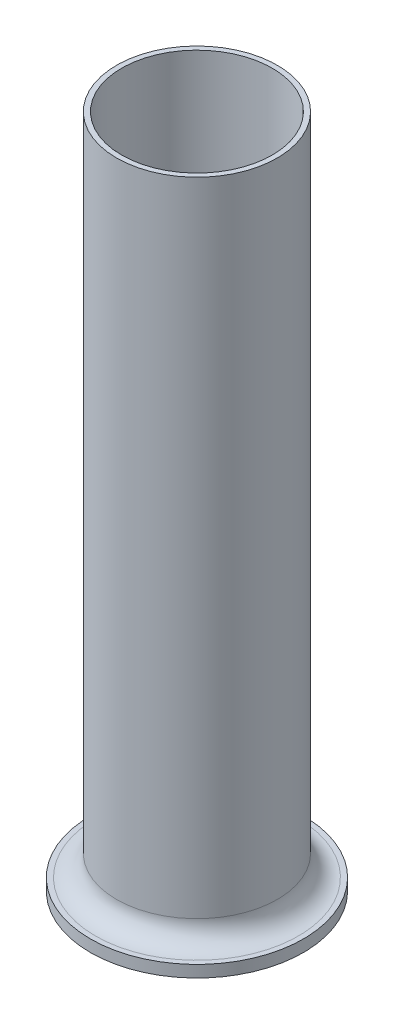
ISO-10303-21;
HEADER;
FILE_DESCRIPTION(('STEP AP214'),'2;1');
FILE_NAME('part.step','',(''),(''),'','','');
FILE_SCHEMA(('AUTOMOTIVE_DESIGN { 1 0 10303 214 1 1 1 1 }'));
ENDSEC;
DATA;
#1=APPLICATION_CONTEXT('core data for automotive mechanical design processes');
#2=APPLICATION_PROTOCOL_DEFINITION('international standard','automotive_design',2000,#1);
#3=PRODUCT_CONTEXT('',#1,'mechanical');
#4=PRODUCT('Part','Part','',(#3));
#5=PRODUCT_RELATED_PRODUCT_CATEGORY('part','',(#4));
#6=PRODUCT_DEFINITION_FORMATION('','',#4);
#7=PRODUCT_DEFINITION_CONTEXT('part definition',#1,'design');
#8=PRODUCT_DEFINITION('design','',#6,#7);
#9=PRODUCT_DEFINITION_SHAPE('','',#8);
#10=(LENGTH_UNIT() NAMED_UNIT(*) SI_UNIT(.MILLI.,.METRE.));
#11=(NAMED_UNIT(*) PLANE_ANGLE_UNIT() SI_UNIT($,.RADIAN.));
#12=(NAMED_UNIT(*) SI_UNIT($,.STERADIAN.) SOLID_ANGLE_UNIT());
#13=UNCERTAINTY_MEASURE_WITH_UNIT(LENGTH_MEASURE(1.E-05),#10,'distance_accuracy_value','');
#14=(GEOMETRIC_REPRESENTATION_CONTEXT(3) GLOBAL_UNCERTAINTY_ASSIGNED_CONTEXT((#13)) GLOBAL_UNIT_ASSIGNED_CONTEXT((#10,
#11,#12)) REPRESENTATION_CONTEXT('',''));
#15=CARTESIAN_POINT('',(0.,0.,0.));
#16=DIRECTION('',(0.,0.,1.));
#17=DIRECTION('',(1.,0.,0.));
#18=AXIS2_PLACEMENT_3D('',#15,#16,#17);
#19=CARTESIAN_POINT('',(0.,0.,0.));
#20=DIRECTION('',(0.,1.,0.));
#21=DIRECTION('',(0.,0.,1.));
#22=AXIS2_PLACEMENT_3D('',#19,#20,#21);
#23=PLANE('',#22);
#24=CARTESIAN_POINT('',(0.,0.,0.));
#25=DIRECTION('',(0.,1.,0.));
#26=DIRECTION('',(0.,0.,1.));
#27=AXIS2_PLACEMENT_3D('',#24,#25,#26);
#28=CIRCLE('',#27,25.25);
#29=CARTESIAN_POINT('',(0.,0.,25.25));
#30=VERTEX_POINT('',#29);
#31=EDGE_CURVE('E62',#30,#30,#28,.T.);
#32=ORIENTED_EDGE('',*,*,#31,.F.);
#33=EDGE_LOOP('',(#32));
#34=FACE_BOUND('',#33,.T.);
#35=CARTESIAN_POINT('',(0.,0.,0.));
#36=DIRECTION('',(0.,1.,0.));
#37=DIRECTION('',(0.,0.,1.));
#38=AXIS2_PLACEMENT_3D('',#35,#36,#37);
#39=CIRCLE('',#38,23.55);
#40=CARTESIAN_POINT('',(-23.55,0.,0.));
#41=VERTEX_POINT('',#40);
#42=EDGE_CURVE('E11',#41,#41,#39,.F.);
#43=ORIENTED_EDGE('',*,*,#42,.F.);
#44=EDGE_LOOP('',(#43));
#45=FACE_BOUND('',#44,.T.);
#46=ADVANCED_FACE('F33',(#34,#45),#23,.F.);
#47=CARTESIAN_POINT('',(0.,0.,0.));
#48=DIRECTION('',(0.,1.,0.));
#49=DIRECTION('',(0.,0.,1.));
#50=AXIS2_PLACEMENT_3D('',#47,#48,#49);
#51=CIRCLE('',#50,17.85);
#52=CARTESIAN_POINT('',(0.,0.,17.85));
#53=VERTEX_POINT('',#52);
#54=EDGE_CURVE('E54',#53,#53,#51,.T.);
#55=ORIENTED_EDGE('',*,*,#54,.T.);
#56=EDGE_LOOP('',(#55));
#57=FACE_BOUND('',#56,.T.);
#58=CARTESIAN_POINT('',(0.,0.,0.));
#59=DIRECTION('',(0.,-1.,0.));
#60=DIRECTION('',(0.,0.,-1.));
#61=AXIS2_PLACEMENT_3D('',#58,#59,#60);
#62=CIRCLE('',#61,19.95);
#63=CARTESIAN_POINT('',(-19.95,0.,0.));
#64=VERTEX_POINT('',#63);
#65=EDGE_CURVE('E41',#64,#64,#62,.F.);
#66=ORIENTED_EDGE('',*,*,#65,.F.);
#67=EDGE_LOOP('',(#66));
#68=FACE_BOUND('',#67,.T.);
#69=ADVANCED_FACE('F98',(#57,#68),#23,.F.);
#70=CARTESIAN_POINT('',(0.,2.8,0.));
#71=DIRECTION('',(0.,-1.,0.));
#72=DIRECTION('',(0.,0.,-1.));
#73=AXIS2_PLACEMENT_3D('',#70,#71,#72);
#74=CYLINDRICAL_SURFACE('',#73,25.25);
#75=CARTESIAN_POINT('',(0.,2.8,0.));
#76=DIRECTION('',(0.,1.,0.));
#77=DIRECTION('',(0.,0.,1.));
#78=AXIS2_PLACEMENT_3D('',#75,#76,#77);
#79=CIRCLE('',#78,25.25);
#80=CARTESIAN_POINT('',(0.,2.8,25.25));
#81=VERTEX_POINT('',#80);
#82=EDGE_CURVE('E63',#81,#81,#79,.T.);
#83=ORIENTED_EDGE('',*,*,#82,.F.);
#84=EDGE_LOOP('',(#83));
#85=FACE_BOUND('',#84,.T.);
#86=ORIENTED_EDGE('',*,*,#31,.T.);
#87=EDGE_LOOP('',(#86));
#88=FACE_BOUND('',#87,.T.);
#89=ADVANCED_FACE('F104',(#85,#88),#74,.T.);
#90=CARTESIAN_POINT('',(0.,2.8,0.));
#91=DIRECTION('',(0.,1.,0.));
#92=DIRECTION('',(0.,0.,1.));
#93=AXIS2_PLACEMENT_3D('',#90,#91,#92);
#94=PLANE('',#93);
#95=CARTESIAN_POINT('',(0.,2.8,0.));
#96=DIRECTION('',(0.,1.,0.));
#97=DIRECTION('',(0.,0.,1.));
#98=AXIS2_PLACEMENT_3D('',#95,#96,#97);
#99=CIRCLE('',#98,24.05);
#100=CARTESIAN_POINT('',(0.,2.8,24.05));
#101=VERTEX_POINT('',#100);
#102=EDGE_CURVE('E71',#101,#101,#99,.F.);
#103=ORIENTED_EDGE('',*,*,#102,.T.);
#104=EDGE_LOOP('',(#103));
#105=FACE_BOUND('',#104,.T.);
#106=ORIENTED_EDGE('',*,*,#82,.T.);
#107=EDGE_LOOP('',(#106));
#108=FACE_BOUND('',#107,.T.);
#109=ADVANCED_FACE('F75',(#105,#108),#94,.T.);
#110=CARTESIAN_POINT('',(0.,160.,0.));
#111=DIRECTION('',(0.,-1.,0.));
#112=DIRECTION('',(0.,0.,-1.));
#113=AXIS2_PLACEMENT_3D('',#110,#111,#112);
#114=CYLINDRICAL_SURFACE('',#113,19.05);
#115=CARTESIAN_POINT('',(0.,7.8,0.));
#116=DIRECTION('',(0.,1.,0.));
#117=DIRECTION('',(0.,0.,1.));
#118=AXIS2_PLACEMENT_3D('',#115,#116,#117);
#119=CIRCLE('',#118,19.05);
#120=CARTESIAN_POINT('',(0.,7.8,19.05));
#121=VERTEX_POINT('',#120);
#122=EDGE_CURVE('E66',#121,#121,#119,.T.);
#123=ORIENTED_EDGE('',*,*,#122,.T.);
#124=EDGE_LOOP('',(#123));
#125=FACE_BOUND('',#124,.T.);
#126=CARTESIAN_POINT('',(0.,160.,0.));
#127=DIRECTION('',(0.,1.,0.));
#128=DIRECTION('',(0.,0.,1.));
#129=AXIS2_PLACEMENT_3D('',#126,#127,#128);
#130=CIRCLE('',#129,19.05);
#131=CARTESIAN_POINT('',(0.,160.,19.05));
#132=VERTEX_POINT('',#131);
#133=EDGE_CURVE('E58',#132,#132,#130,.T.);
#134=ORIENTED_EDGE('',*,*,#133,.F.);
#135=EDGE_LOOP('',(#134));
#136=FACE_BOUND('',#135,.T.);
#137=ADVANCED_FACE('F84',(#125,#136),#114,.T.);
#138=CARTESIAN_POINT('',(0.,160.,0.));
#139=DIRECTION('',(0.,1.,0.));
#140=DIRECTION('',(0.,0.,1.));
#141=AXIS2_PLACEMENT_3D('',#138,#139,#140);
#142=PLANE('',#141);
#143=CARTESIAN_POINT('',(0.,160.,0.));
#144=DIRECTION('',(0.,1.,0.));
#145=DIRECTION('',(0.,0.,1.));
#146=AXIS2_PLACEMENT_3D('',#143,#144,#145);
#147=CIRCLE('',#146,17.85);
#148=CARTESIAN_POINT('',(0.,160.,17.85));
#149=VERTEX_POINT('',#148);
#150=EDGE_CURVE('E51',#149,#149,#147,.T.);
#151=ORIENTED_EDGE('',*,*,#150,.F.);
#152=EDGE_LOOP('',(#151));
#153=FACE_BOUND('',#152,.T.);
#154=ORIENTED_EDGE('',*,*,#133,.T.);
#155=EDGE_LOOP('',(#154));
#156=FACE_BOUND('',#155,.T.);
#157=ADVANCED_FACE('F81',(#153,#156),#142,.T.);
#158=CARTESIAN_POINT('',(0.,7.8,0.));
#159=DIRECTION('',(0.,1.,0.));
#160=DIRECTION('',(0.,0.,1.));
#161=AXIS2_PLACEMENT_3D('',#158,#159,#160);
#162=TOROIDAL_SURFACE('',#161,24.05,5.);
#163=ORIENTED_EDGE('',*,*,#102,.F.);
#164=EDGE_LOOP('',(#163));
#165=FACE_BOUND('',#164,.T.);
#166=ORIENTED_EDGE('',*,*,#122,.F.);
#167=EDGE_LOOP('',(#166));
#168=FACE_BOUND('',#167,.T.);
#169=ADVANCED_FACE('F35',(#165,#168),#162,.F.);
#170=CARTESIAN_POINT('',(0.,0.,0.));
#171=DIRECTION('',(0.,1.,0.));
#172=DIRECTION('',(0.,0.,1.));
#173=AXIS2_PLACEMENT_3D('',#170,#171,#172);
#174=CYLINDRICAL_SURFACE('',#173,17.85);
#175=ORIENTED_EDGE('',*,*,#54,.F.);
#176=EDGE_LOOP('',(#175));
#177=FACE_BOUND('',#176,.T.);
#178=ORIENTED_EDGE('',*,*,#150,.T.);
#179=EDGE_LOOP('',(#178));
#180=FACE_BOUND('',#179,.T.);
#181=ADVANCED_FACE('F80',(#177,#180),#174,.F.);
#182=CARTESIAN_POINT('',(0.,0.,0.));
#183=DIRECTION('',(0.,-1.,0.));
#184=DIRECTION('',(0.,0.,-1.));
#185=AXIS2_PLACEMENT_3D('',#182,#183,#184);
#186=TOROIDAL_SURFACE('',#185,21.75,1.8);
#187=ORIENTED_EDGE('',*,*,#42,.T.);
#188=CARTESIAN_POINT('',(-21.75,0.,0.));
#189=DIRECTION('',(0.,0.,1.));
#190=DIRECTION('',(1.,0.,0.));
#191=AXIS2_PLACEMENT_3D('',#188,#189,#190);
#192=CIRCLE('',#191,1.8);
#193=EDGE_CURVE('E47',#64,#41,#192,.T.);
#194=ORIENTED_EDGE('',*,*,#193,.F.);
#195=ORIENTED_EDGE('',*,*,#65,.T.);
#196=ORIENTED_EDGE('',*,*,#193,.T.);
#197=EDGE_LOOP('',(#187,#194,#195,#196));
#198=FACE_BOUND('',#197,.T.);
#199=ADVANCED_FACE('F48',(#198),#186,.F.);
#200=CLOSED_SHELL('',(#46,#69,#89,#109,#137,#157,#169,#181,#199));
#201=MANIFOLD_SOLID_BREP('B2',#200);
#202=ADVANCED_BREP_SHAPE_REPRESENTATION('',(#18,#201),#14);
#203=SHAPE_DEFINITION_REPRESENTATION(#9,#202);
ENDSEC;
END-ISO-10303-21;
